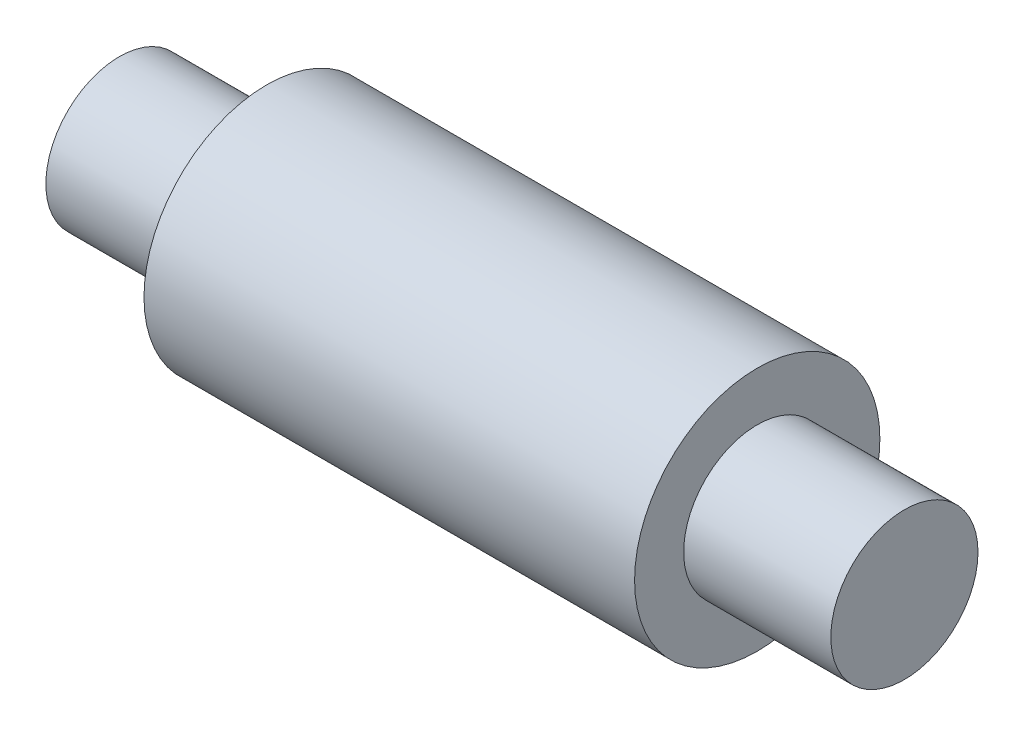
ISO-10303-21;
HEADER;
FILE_DESCRIPTION(('STEP AP214'),'2;1');
FILE_NAME('part.step','',(''),(''),'','','');
FILE_SCHEMA(('AUTOMOTIVE_DESIGN { 1 0 10303 214 1 1 1 1 }'));
ENDSEC;
DATA;
#1=APPLICATION_CONTEXT('core data for automotive mechanical design processes');
#2=APPLICATION_PROTOCOL_DEFINITION('international standard','automotive_design',2000,#1);
#3=PRODUCT_CONTEXT('',#1,'mechanical');
#4=PRODUCT('Part','Part','',(#3));
#5=PRODUCT_RELATED_PRODUCT_CATEGORY('part','',(#4));
#6=PRODUCT_DEFINITION_FORMATION('','',#4);
#7=PRODUCT_DEFINITION_CONTEXT('part definition',#1,'design');
#8=PRODUCT_DEFINITION('design','',#6,#7);
#9=PRODUCT_DEFINITION_SHAPE('','',#8);
#10=(LENGTH_UNIT() NAMED_UNIT(*) SI_UNIT(.MILLI.,.METRE.));
#11=(NAMED_UNIT(*) PLANE_ANGLE_UNIT() SI_UNIT($,.RADIAN.));
#12=(NAMED_UNIT(*) SI_UNIT($,.STERADIAN.) SOLID_ANGLE_UNIT());
#13=UNCERTAINTY_MEASURE_WITH_UNIT(LENGTH_MEASURE(1.E-05),#10,'distance_accuracy_value','');
#14=(GEOMETRIC_REPRESENTATION_CONTEXT(3) GLOBAL_UNCERTAINTY_ASSIGNED_CONTEXT((#13)) GLOBAL_UNIT_ASSIGNED_CONTEXT((#10,
#11,#12)) REPRESENTATION_CONTEXT('',''));
#15=CARTESIAN_POINT('',(0.,0.,0.));
#16=DIRECTION('',(0.,0.,1.));
#17=DIRECTION('',(1.,0.,0.));
#18=AXIS2_PLACEMENT_3D('',#15,#16,#17);
#19=CARTESIAN_POINT('',(127.,0.,0.));
#20=DIRECTION('',(-1.,0.,0.));
#21=DIRECTION('',(0.,0.,1.));
#22=AXIS2_PLACEMENT_3D('',#19,#20,#21);
#23=CYLINDRICAL_SURFACE('',#22,63.5);
#24=CARTESIAN_POINT('',(127.,0.,0.));
#25=DIRECTION('',(1.,0.,0.));
#26=DIRECTION('',(0.,0.,-1.));
#27=AXIS2_PLACEMENT_3D('',#24,#25,#26);
#28=CIRCLE('',#27,63.5);
#29=CARTESIAN_POINT('',(127.,0.,-63.5));
#30=VERTEX_POINT('',#29);
#31=EDGE_CURVE('E43',#30,#30,#28,.T.);
#32=ORIENTED_EDGE('',*,*,#31,.F.);
#33=EDGE_LOOP('',(#32));
#34=FACE_BOUND('',#33,.T.);
#35=CARTESIAN_POINT('',(-127.,0.,0.));
#36=DIRECTION('',(1.,0.,0.));
#37=DIRECTION('',(0.,0.,-1.));
#38=AXIS2_PLACEMENT_3D('',#35,#36,#37);
#39=CIRCLE('',#38,63.5);
#40=CARTESIAN_POINT('',(-127.,0.,-63.5));
#41=VERTEX_POINT('',#40);
#42=EDGE_CURVE('E47',#41,#41,#39,.T.);
#43=ORIENTED_EDGE('',*,*,#42,.T.);
#44=EDGE_LOOP('',(#43));
#45=FACE_BOUND('',#44,.T.);
#46=ADVANCED_FACE('F37',(#34,#45),#23,.T.);
#47=CARTESIAN_POINT('',(127.,0.,0.));
#48=DIRECTION('',(1.,0.,0.));
#49=DIRECTION('',(0.,0.,-1.));
#50=AXIS2_PLACEMENT_3D('',#47,#48,#49);
#51=PLANE('',#50);
#52=CARTESIAN_POINT('',(127.,0.,0.));
#53=DIRECTION('',(1.,0.,0.));
#54=DIRECTION('',(0.,0.,-1.));
#55=AXIS2_PLACEMENT_3D('',#52,#53,#54);
#56=CIRCLE('',#55,38.1);
#57=CARTESIAN_POINT('',(127.,0.,-38.1));
#58=VERTEX_POINT('',#57);
#59=EDGE_CURVE('E52',#58,#58,#56,.F.);
#60=ORIENTED_EDGE('',*,*,#59,.T.);
#61=EDGE_LOOP('',(#60));
#62=FACE_BOUND('',#61,.T.);
#63=ORIENTED_EDGE('',*,*,#31,.T.);
#64=EDGE_LOOP('',(#63));
#65=FACE_BOUND('',#64,.T.);
#66=ADVANCED_FACE('F81',(#62,#65),#51,.T.);
#67=CARTESIAN_POINT('',(-127.,0.,0.));
#68=DIRECTION('',(1.,0.,0.));
#69=DIRECTION('',(0.,0.,-1.));
#70=AXIS2_PLACEMENT_3D('',#67,#68,#69);
#71=PLANE('',#70);
#72=CARTESIAN_POINT('',(-127.,0.,0.));
#73=DIRECTION('',(1.,0.,0.));
#74=DIRECTION('',(0.,0.,-1.));
#75=AXIS2_PLACEMENT_3D('',#72,#73,#74);
#76=CIRCLE('',#75,38.1);
#77=CARTESIAN_POINT('',(-127.,0.,-38.1));
#78=VERTEX_POINT('',#77);
#79=EDGE_CURVE('E10',#78,#78,#76,.F.);
#80=ORIENTED_EDGE('',*,*,#79,.F.);
#81=EDGE_LOOP('',(#80));
#82=FACE_BOUND('',#81,.T.);
#83=ORIENTED_EDGE('',*,*,#42,.F.);
#84=EDGE_LOOP('',(#83));
#85=FACE_BOUND('',#84,.T.);
#86=ADVANCED_FACE('F86',(#82,#85),#71,.F.);
#87=CARTESIAN_POINT('',(-203.2,0.,0.));
#88=DIRECTION('',(1.,0.,0.));
#89=DIRECTION('',(0.,0.,-1.));
#90=AXIS2_PLACEMENT_3D('',#87,#88,#89);
#91=PLANE('',#90);
#92=CARTESIAN_POINT('',(-203.2,0.,0.));
#93=DIRECTION('',(1.,0.,0.));
#94=DIRECTION('',(0.,0.,-1.));
#95=AXIS2_PLACEMENT_3D('',#92,#93,#94);
#96=CIRCLE('',#95,38.1);
#97=CARTESIAN_POINT('',(-203.2,0.,-38.1));
#98=VERTEX_POINT('',#97);
#99=EDGE_CURVE('E57',#98,#98,#96,.T.);
#100=ORIENTED_EDGE('',*,*,#99,.F.);
#101=EDGE_LOOP('',(#100));
#102=FACE_BOUND('',#101,.T.);
#103=ADVANCED_FACE('F75',(#102),#91,.F.);
#104=CARTESIAN_POINT('',(203.2,0.,0.));
#105=DIRECTION('',(-1.,0.,0.));
#106=DIRECTION('',(0.,0.,1.));
#107=AXIS2_PLACEMENT_3D('',#104,#105,#106);
#108=CYLINDRICAL_SURFACE('',#107,38.1);
#109=ORIENTED_EDGE('',*,*,#99,.T.);
#110=EDGE_LOOP('',(#109));
#111=FACE_BOUND('',#110,.T.);
#112=ORIENTED_EDGE('',*,*,#79,.T.);
#113=EDGE_LOOP('',(#112));
#114=FACE_BOUND('',#113,.T.);
#115=ADVANCED_FACE('F67',(#111,#114),#108,.T.);
#116=ORIENTED_EDGE('',*,*,#59,.F.);
#117=EDGE_LOOP('',(#116));
#118=FACE_BOUND('',#117,.T.);
#119=CARTESIAN_POINT('',(203.2,0.,0.));
#120=DIRECTION('',(1.,0.,0.));
#121=DIRECTION('',(0.,0.,-1.));
#122=AXIS2_PLACEMENT_3D('',#119,#120,#121);
#123=CIRCLE('',#122,38.1);
#124=CARTESIAN_POINT('',(203.2,0.,-38.1));
#125=VERTEX_POINT('',#124);
#126=EDGE_CURVE('E56',#125,#125,#123,.T.);
#127=ORIENTED_EDGE('',*,*,#126,.F.);
#128=EDGE_LOOP('',(#127));
#129=FACE_BOUND('',#128,.T.);
#130=ADVANCED_FACE('F65',(#118,#129),#108,.T.);
#131=CARTESIAN_POINT('',(203.2,0.,0.));
#132=DIRECTION('',(1.,0.,0.));
#133=DIRECTION('',(0.,0.,-1.));
#134=AXIS2_PLACEMENT_3D('',#131,#132,#133);
#135=PLANE('',#134);
#136=ORIENTED_EDGE('',*,*,#126,.T.);
#137=EDGE_LOOP('',(#136));
#138=FACE_BOUND('',#137,.T.);
#139=ADVANCED_FACE('F63',(#138),#135,.T.);
#140=CLOSED_SHELL('',(#46,#66,#86,#103,#115,#130,#139));
#141=MANIFOLD_SOLID_BREP('B2',#140);
#142=ADVANCED_BREP_SHAPE_REPRESENTATION('',(#18,#141),#14);
#143=SHAPE_DEFINITION_REPRESENTATION(#9,#142);
ENDSEC;
END-ISO-10303-21;
